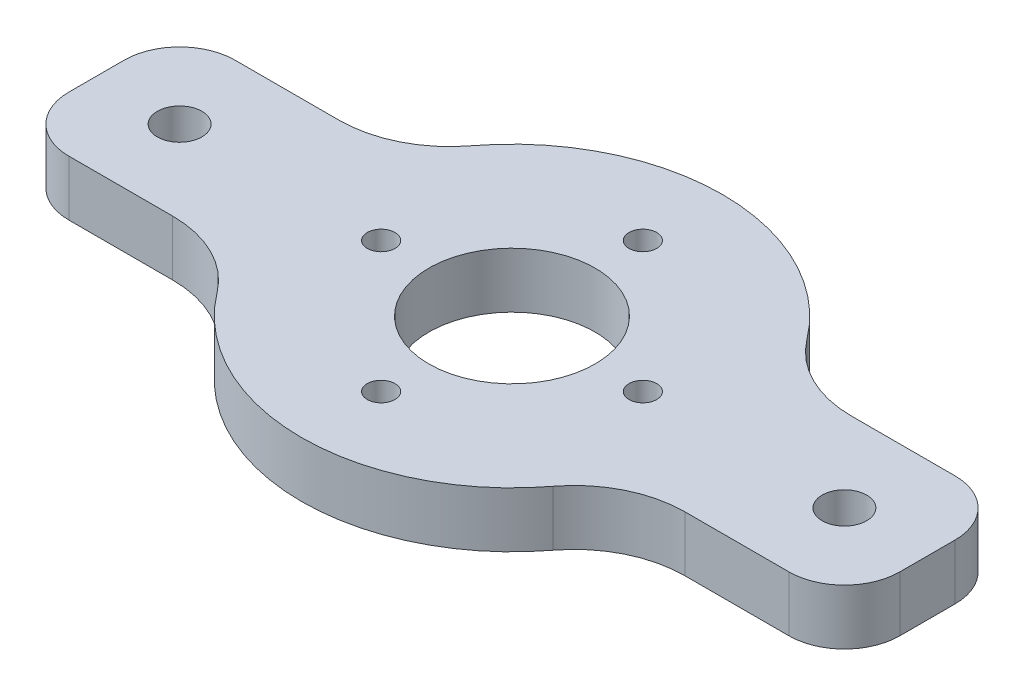
ISO-10303-21;
HEADER;
FILE_DESCRIPTION(('STEP AP214'),'2;1');
FILE_NAME('part.step','',(''),(''),'','','');
FILE_SCHEMA(('AUTOMOTIVE_DESIGN { 1 0 10303 214 1 1 1 1 }'));
ENDSEC;
DATA;
#1=APPLICATION_CONTEXT('core data for automotive mechanical design processes');
#2=APPLICATION_PROTOCOL_DEFINITION('international standard','automotive_design',2000,#1);
#3=PRODUCT_CONTEXT('',#1,'mechanical');
#4=PRODUCT('Part','Part','',(#3));
#5=PRODUCT_RELATED_PRODUCT_CATEGORY('part','',(#4));
#6=PRODUCT_DEFINITION_FORMATION('','',#4);
#7=PRODUCT_DEFINITION_CONTEXT('part definition',#1,'design');
#8=PRODUCT_DEFINITION('design','',#6,#7);
#9=PRODUCT_DEFINITION_SHAPE('','',#8);
#10=(LENGTH_UNIT() NAMED_UNIT(*) SI_UNIT(.MILLI.,.METRE.));
#11=(NAMED_UNIT(*) PLANE_ANGLE_UNIT() SI_UNIT($,.RADIAN.));
#12=(NAMED_UNIT(*) SI_UNIT($,.STERADIAN.) SOLID_ANGLE_UNIT());
#13=UNCERTAINTY_MEASURE_WITH_UNIT(LENGTH_MEASURE(1.E-05),#10,'distance_accuracy_value','');
#14=(GEOMETRIC_REPRESENTATION_CONTEXT(3) GLOBAL_UNCERTAINTY_ASSIGNED_CONTEXT((#13)) GLOBAL_UNIT_ASSIGNED_CONTEXT((#10,
#11,#12)) REPRESENTATION_CONTEXT('',''));
#15=CARTESIAN_POINT('',(0.,0.,0.));
#16=DIRECTION('',(0.,0.,1.));
#17=DIRECTION('',(1.,0.,0.));
#18=AXIS2_PLACEMENT_3D('',#15,#16,#17);
#19=CARTESIAN_POINT('',(0.,6.35,-9.525));
#20=DIRECTION('',(0.,0.,-1.));
#21=DIRECTION('',(-1.,0.,0.));
#22=AXIS2_PLACEMENT_3D('',#19,#20,#21);
#23=PLANE('',#22);
#24=DIRECTION('',(1.,0.,0.));
#25=VECTOR('',#24,1.);
#26=CARTESIAN_POINT('',(0.,0.,-9.525));
#27=LINE('',#26,#25);
#28=CARTESIAN_POINT('',(29.3683209428118,0.,-9.525));
#29=VERTEX_POINT('',#28);
#30=CARTESIAN_POINT('',(41.275,0.,-9.525));
#31=VERTEX_POINT('',#30);
#32=EDGE_CURVE('E222',#29,#31,#27,.T.);
#33=ORIENTED_EDGE('',*,*,#32,.F.);
#34=DIRECTION('',(0.,-1.,0.));
#35=VECTOR('',#34,1.);
#36=CARTESIAN_POINT('',(29.3683209428118,6.35,-9.525));
#37=LINE('',#36,#35);
#38=CARTESIAN_POINT('',(29.3683209428118,6.35,-9.525));
#39=VERTEX_POINT('',#38);
#40=EDGE_CURVE('E11',#39,#29,#37,.T.);
#41=ORIENTED_EDGE('',*,*,#40,.F.);
#42=DIRECTION('',(1.,0.,0.));
#43=VECTOR('',#42,1.);
#44=CARTESIAN_POINT('',(0.,6.35,-9.525));
#45=LINE('',#44,#43);
#46=CARTESIAN_POINT('',(41.275,6.35,-9.525));
#47=VERTEX_POINT('',#46);
#48=EDGE_CURVE('E305',#39,#47,#45,.T.);
#49=ORIENTED_EDGE('',*,*,#48,.T.);
#50=DIRECTION('',(0.,-1.,0.));
#51=VECTOR('',#50,1.);
#52=CARTESIAN_POINT('',(41.275,6.35,-9.525));
#53=LINE('',#52,#51);
#54=EDGE_CURVE('E62',#47,#31,#53,.T.);
#55=ORIENTED_EDGE('',*,*,#54,.T.);
#56=EDGE_LOOP('',(#33,#41,#49,#55));
#57=FACE_BOUND('',#56,.T.);
#58=ADVANCED_FACE('F45',(#57),#23,.T.);
#59=CARTESIAN_POINT('',(29.3683209428118,6.35,-22.225));
#60=DIRECTION('',(0.,-1.,0.));
#61=DIRECTION('',(0.,0.,-1.));
#62=AXIS2_PLACEMENT_3D('',#59,#60,#61);
#63=CYLINDRICAL_SURFACE('',#62,12.7);
#64=CARTESIAN_POINT('',(29.3683209428118,0.,-22.225));
#65=DIRECTION('',(0.,1.,0.));
#66=DIRECTION('',(0.,0.,1.));
#67=AXIS2_PLACEMENT_3D('',#64,#65,#66);
#68=CIRCLE('',#67,12.7);
#69=CARTESIAN_POINT('',(19.2413137211526,0.,-14.5612068965517));
#70=VERTEX_POINT('',#69);
#71=EDGE_CURVE('E225',#29,#70,#68,.F.);
#72=ORIENTED_EDGE('',*,*,#71,.T.);
#73=DIRECTION('',(0.,-1.,0.));
#74=VECTOR('',#73,1.);
#75=CARTESIAN_POINT('',(19.2413137211526,6.35,-14.5612068965517));
#76=LINE('',#75,#74);
#77=CARTESIAN_POINT('',(19.2413137211526,6.35,-14.5612068965517));
#78=VERTEX_POINT('',#77);
#79=EDGE_CURVE('E54',#78,#70,#76,.T.);
#80=ORIENTED_EDGE('',*,*,#79,.F.);
#81=CARTESIAN_POINT('',(29.3683209428118,6.35,-22.225));
#82=DIRECTION('',(0.,1.,0.));
#83=DIRECTION('',(0.,0.,1.));
#84=AXIS2_PLACEMENT_3D('',#81,#82,#83);
#85=CIRCLE('',#84,12.7);
#86=EDGE_CURVE('E375',#39,#78,#85,.F.);
#87=ORIENTED_EDGE('',*,*,#86,.F.);
#88=ORIENTED_EDGE('',*,*,#40,.T.);
#89=EDGE_LOOP('',(#72,#80,#87,#88));
#90=FACE_BOUND('',#89,.T.);
#91=ADVANCED_FACE('F424',(#90),#63,.F.);
#92=CARTESIAN_POINT('',(0.,6.35,0.));
#93=DIRECTION('',(0.,-1.,0.));
#94=DIRECTION('',(0.,0.,-1.));
#95=AXIS2_PLACEMENT_3D('',#92,#93,#94);
#96=CYLINDRICAL_SURFACE('',#95,24.13);
#97=CARTESIAN_POINT('',(0.,0.,0.));
#98=DIRECTION('',(0.,1.,0.));
#99=DIRECTION('',(0.,0.,1.));
#100=AXIS2_PLACEMENT_3D('',#97,#98,#99);
#101=CIRCLE('',#100,24.13);
#102=CARTESIAN_POINT('',(-19.2413137211526,0.,-14.5612068965517));
#103=VERTEX_POINT('',#102);
#104=EDGE_CURVE('E228',#70,#103,#101,.T.);
#105=ORIENTED_EDGE('',*,*,#104,.T.);
#106=DIRECTION('',(0.,-1.,0.));
#107=VECTOR('',#106,1.);
#108=CARTESIAN_POINT('',(-19.2413137211526,6.35,-14.5612068965517));
#109=LINE('',#108,#107);
#110=CARTESIAN_POINT('',(-19.2413137211526,6.35,-14.5612068965517));
#111=VERTEX_POINT('',#110);
#112=EDGE_CURVE('E342',#111,#103,#109,.T.);
#113=ORIENTED_EDGE('',*,*,#112,.F.);
#114=CARTESIAN_POINT('',(0.,6.35,0.));
#115=DIRECTION('',(0.,1.,0.));
#116=DIRECTION('',(0.,0.,1.));
#117=AXIS2_PLACEMENT_3D('',#114,#115,#116);
#118=CIRCLE('',#117,24.13);
#119=EDGE_CURVE('E352',#78,#111,#118,.T.);
#120=ORIENTED_EDGE('',*,*,#119,.F.);
#121=ORIENTED_EDGE('',*,*,#79,.T.);
#122=EDGE_LOOP('',(#105,#113,#120,#121));
#123=FACE_BOUND('',#122,.T.);
#124=ADVANCED_FACE('F350',(#123),#96,.T.);
#125=CARTESIAN_POINT('',(-29.3683209428118,6.35,-22.225));
#126=DIRECTION('',(0.,-1.,0.));
#127=DIRECTION('',(0.,0.,-1.));
#128=AXIS2_PLACEMENT_3D('',#125,#126,#127);
#129=CYLINDRICAL_SURFACE('',#128,12.7);
#130=CARTESIAN_POINT('',(-29.3683209428118,0.,-22.225));
#131=DIRECTION('',(0.,1.,0.));
#132=DIRECTION('',(0.,0.,1.));
#133=AXIS2_PLACEMENT_3D('',#130,#131,#132);
#134=CIRCLE('',#133,12.7);
#135=CARTESIAN_POINT('',(-29.3683209428118,0.,-9.525));
#136=VERTEX_POINT('',#135);
#137=EDGE_CURVE('E232',#136,#103,#134,.T.);
#138=ORIENTED_EDGE('',*,*,#137,.F.);
#139=DIRECTION('',(0.,-1.,0.));
#140=VECTOR('',#139,1.);
#141=CARTESIAN_POINT('',(-29.3683209428118,6.35,-9.525));
#142=LINE('',#141,#140);
#143=CARTESIAN_POINT('',(-29.3683209428118,6.35,-9.525));
#144=VERTEX_POINT('',#143);
#145=EDGE_CURVE('E339',#144,#136,#142,.T.);
#146=ORIENTED_EDGE('',*,*,#145,.F.);
#147=CARTESIAN_POINT('',(-29.3683209428118,6.35,-22.225));
#148=DIRECTION('',(0.,1.,0.));
#149=DIRECTION('',(0.,0.,1.));
#150=AXIS2_PLACEMENT_3D('',#147,#148,#149);
#151=CIRCLE('',#150,12.7);
#152=EDGE_CURVE('E365',#144,#111,#151,.T.);
#153=ORIENTED_EDGE('',*,*,#152,.T.);
#154=ORIENTED_EDGE('',*,*,#112,.T.);
#155=EDGE_LOOP('',(#138,#146,#153,#154));
#156=FACE_BOUND('',#155,.T.);
#157=ADVANCED_FACE('F362',(#156),#129,.F.);
#158=CARTESIAN_POINT('',(0.,6.35,-9.525));
#159=DIRECTION('',(0.,0.,-1.));
#160=DIRECTION('',(-1.,0.,0.));
#161=AXIS2_PLACEMENT_3D('',#158,#159,#160);
#162=PLANE('',#161);
#163=DIRECTION('',(1.,0.,0.));
#164=VECTOR('',#163,1.);
#165=CARTESIAN_POINT('',(0.,0.,-9.525));
#166=LINE('',#165,#164);
#167=CARTESIAN_POINT('',(-41.275,0.,-9.525));
#168=VERTEX_POINT('',#167);
#169=EDGE_CURVE('E236',#168,#136,#166,.T.);
#170=ORIENTED_EDGE('',*,*,#169,.F.);
#171=DIRECTION('',(0.,-1.,0.));
#172=VECTOR('',#171,1.);
#173=CARTESIAN_POINT('',(-41.275,6.35,-9.525));
#174=LINE('',#173,#172);
#175=CARTESIAN_POINT('',(-41.275,6.35,-9.525));
#176=VERTEX_POINT('',#175);
#177=EDGE_CURVE('E336',#176,#168,#174,.T.);
#178=ORIENTED_EDGE('',*,*,#177,.F.);
#179=DIRECTION('',(1.,0.,0.));
#180=VECTOR('',#179,1.);
#181=CARTESIAN_POINT('',(0.,6.35,-9.525));
#182=LINE('',#181,#180);
#183=EDGE_CURVE('E369',#176,#144,#182,.T.);
#184=ORIENTED_EDGE('',*,*,#183,.T.);
#185=ORIENTED_EDGE('',*,*,#145,.T.);
#186=EDGE_LOOP('',(#170,#178,#184,#185));
#187=FACE_BOUND('',#186,.T.);
#188=ADVANCED_FACE('F632',(#187),#162,.T.);
#189=CARTESIAN_POINT('',(-41.275,6.35,-3.175));
#190=DIRECTION('',(0.,-1.,0.));
#191=DIRECTION('',(0.,0.,-1.));
#192=AXIS2_PLACEMENT_3D('',#189,#190,#191);
#193=CYLINDRICAL_SURFACE('',#192,6.35);
#194=CARTESIAN_POINT('',(-41.275,0.,-3.175));
#195=DIRECTION('',(0.,1.,0.));
#196=DIRECTION('',(0.,0.,1.));
#197=AXIS2_PLACEMENT_3D('',#194,#195,#196);
#198=CIRCLE('',#197,6.35);
#199=CARTESIAN_POINT('',(-47.625,0.,-3.175));
#200=VERTEX_POINT('',#199);
#201=EDGE_CURVE('E240',#168,#200,#198,.T.);
#202=ORIENTED_EDGE('',*,*,#201,.T.);
#203=DIRECTION('',(0.,-1.,0.));
#204=VECTOR('',#203,1.);
#205=CARTESIAN_POINT('',(-47.625,6.35,-3.175));
#206=LINE('',#205,#204);
#207=CARTESIAN_POINT('',(-47.625,6.35,-3.175));
#208=VERTEX_POINT('',#207);
#209=EDGE_CURVE('E332',#208,#200,#206,.T.);
#210=ORIENTED_EDGE('',*,*,#209,.F.);
#211=CARTESIAN_POINT('',(-41.275,6.35,-3.175));
#212=DIRECTION('',(0.,1.,0.));
#213=DIRECTION('',(0.,0.,1.));
#214=AXIS2_PLACEMENT_3D('',#211,#212,#213);
#215=CIRCLE('',#214,6.35);
#216=EDGE_CURVE('E373',#176,#208,#215,.T.);
#217=ORIENTED_EDGE('',*,*,#216,.F.);
#218=ORIENTED_EDGE('',*,*,#177,.T.);
#219=EDGE_LOOP('',(#202,#210,#217,#218));
#220=FACE_BOUND('',#219,.T.);
#221=ADVANCED_FACE('F621',(#220),#193,.T.);
#222=CARTESIAN_POINT('',(-47.625,6.35,0.));
#223=DIRECTION('',(1.,0.,0.));
#224=DIRECTION('',(0.,0.,-1.));
#225=AXIS2_PLACEMENT_3D('',#222,#223,#224);
#226=PLANE('',#225);
#227=DIRECTION('',(0.,0.,1.));
#228=VECTOR('',#227,1.);
#229=CARTESIAN_POINT('',(-47.625,0.,0.));
#230=LINE('',#229,#228);
#231=CARTESIAN_POINT('',(-47.625,0.,3.175));
#232=VERTEX_POINT('',#231);
#233=EDGE_CURVE('E243',#200,#232,#230,.T.);
#234=ORIENTED_EDGE('',*,*,#233,.T.);
#235=DIRECTION('',(0.,-1.,0.));
#236=VECTOR('',#235,1.);
#237=CARTESIAN_POINT('',(-47.625,6.35,3.175));
#238=LINE('',#237,#236);
#239=CARTESIAN_POINT('',(-47.625,6.35,3.175));
#240=VERTEX_POINT('',#239);
#241=EDGE_CURVE('E329',#240,#232,#238,.T.);
#242=ORIENTED_EDGE('',*,*,#241,.F.);
#243=DIRECTION('',(0.,0.,1.));
#244=VECTOR('',#243,1.);
#245=CARTESIAN_POINT('',(-47.625,6.35,0.));
#246=LINE('',#245,#244);
#247=EDGE_CURVE('E381',#208,#240,#246,.T.);
#248=ORIENTED_EDGE('',*,*,#247,.F.);
#249=ORIENTED_EDGE('',*,*,#209,.T.);
#250=EDGE_LOOP('',(#234,#242,#248,#249));
#251=FACE_BOUND('',#250,.T.);
#252=ADVANCED_FACE('F610',(#251),#226,.F.);
#253=CARTESIAN_POINT('',(-41.275,6.35,3.175));
#254=DIRECTION('',(0.,-1.,0.));
#255=DIRECTION('',(0.,0.,-1.));
#256=AXIS2_PLACEMENT_3D('',#253,#254,#255);
#257=CYLINDRICAL_SURFACE('',#256,6.35);
#258=CARTESIAN_POINT('',(-41.275,0.,3.175));
#259=DIRECTION('',(0.,1.,0.));
#260=DIRECTION('',(0.,0.,1.));
#261=AXIS2_PLACEMENT_3D('',#258,#259,#260);
#262=CIRCLE('',#261,6.35);
#263=CARTESIAN_POINT('',(-41.275,0.,9.525));
#264=VERTEX_POINT('',#263);
#265=EDGE_CURVE('E247',#264,#232,#262,.F.);
#266=ORIENTED_EDGE('',*,*,#265,.F.);
#267=DIRECTION('',(0.,-1.,0.));
#268=VECTOR('',#267,1.);
#269=CARTESIAN_POINT('',(-41.275,6.35,9.525));
#270=LINE('',#269,#268);
#271=CARTESIAN_POINT('',(-41.275,6.35,9.525));
#272=VERTEX_POINT('',#271);
#273=EDGE_CURVE('E326',#272,#264,#270,.T.);
#274=ORIENTED_EDGE('',*,*,#273,.F.);
#275=CARTESIAN_POINT('',(-41.275,6.35,3.175));
#276=DIRECTION('',(0.,1.,0.));
#277=DIRECTION('',(0.,0.,1.));
#278=AXIS2_PLACEMENT_3D('',#275,#276,#277);
#279=CIRCLE('',#278,6.35);
#280=EDGE_CURVE('E384',#272,#240,#279,.F.);
#281=ORIENTED_EDGE('',*,*,#280,.T.);
#282=ORIENTED_EDGE('',*,*,#241,.T.);
#283=EDGE_LOOP('',(#266,#274,#281,#282));
#284=FACE_BOUND('',#283,.T.);
#285=ADVANCED_FACE('F599',(#284),#257,.T.);
#286=CARTESIAN_POINT('',(0.,6.35,9.525));
#287=DIRECTION('',(0.,0.,-1.));
#288=DIRECTION('',(-1.,0.,0.));
#289=AXIS2_PLACEMENT_3D('',#286,#287,#288);
#290=PLANE('',#289);
#291=DIRECTION('',(1.,0.,0.));
#292=VECTOR('',#291,1.);
#293=CARTESIAN_POINT('',(0.,0.,9.525));
#294=LINE('',#293,#292);
#295=CARTESIAN_POINT('',(-29.3683209428118,0.,9.525));
#296=VERTEX_POINT('',#295);
#297=EDGE_CURVE('E251',#264,#296,#294,.T.);
#298=ORIENTED_EDGE('',*,*,#297,.T.);
#299=DIRECTION('',(0.,-1.,0.));
#300=VECTOR('',#299,1.);
#301=CARTESIAN_POINT('',(-29.3683209428118,6.35,9.525));
#302=LINE('',#301,#300);
#303=CARTESIAN_POINT('',(-29.3683209428118,6.35,9.525));
#304=VERTEX_POINT('',#303);
#305=EDGE_CURVE('E322',#304,#296,#302,.T.);
#306=ORIENTED_EDGE('',*,*,#305,.F.);
#307=DIRECTION('',(1.,0.,0.));
#308=VECTOR('',#307,1.);
#309=CARTESIAN_POINT('',(0.,6.35,9.525));
#310=LINE('',#309,#308);
#311=EDGE_CURVE('E388',#272,#304,#310,.T.);
#312=ORIENTED_EDGE('',*,*,#311,.F.);
#313=ORIENTED_EDGE('',*,*,#273,.T.);
#314=EDGE_LOOP('',(#298,#306,#312,#313));
#315=FACE_BOUND('',#314,.T.);
#316=ADVANCED_FACE('F588',(#315),#290,.F.);
#317=CARTESIAN_POINT('',(-29.3683209428118,6.35,22.225));
#318=DIRECTION('',(0.,-1.,0.));
#319=DIRECTION('',(0.,0.,-1.));
#320=AXIS2_PLACEMENT_3D('',#317,#318,#319);
#321=CYLINDRICAL_SURFACE('',#320,12.7);
#322=CARTESIAN_POINT('',(-29.3683209428118,0.,22.225));
#323=DIRECTION('',(0.,1.,0.));
#324=DIRECTION('',(0.,0.,1.));
#325=AXIS2_PLACEMENT_3D('',#322,#323,#324);
#326=CIRCLE('',#325,12.7);
#327=CARTESIAN_POINT('',(-19.2413137211526,0.,14.5612068965517));
#328=VERTEX_POINT('',#327);
#329=EDGE_CURVE('E254',#296,#328,#326,.F.);
#330=ORIENTED_EDGE('',*,*,#329,.T.);
#331=DIRECTION('',(0.,-1.,0.));
#332=VECTOR('',#331,1.);
#333=CARTESIAN_POINT('',(-19.2413137211526,6.35,14.5612068965517));
#334=LINE('',#333,#332);
#335=CARTESIAN_POINT('',(-19.2413137211526,6.35,14.5612068965517));
#336=VERTEX_POINT('',#335);
#337=EDGE_CURVE('E318',#336,#328,#334,.T.);
#338=ORIENTED_EDGE('',*,*,#337,.F.);
#339=CARTESIAN_POINT('',(-29.3683209428118,6.35,22.225));
#340=DIRECTION('',(0.,1.,0.));
#341=DIRECTION('',(0.,0.,1.));
#342=AXIS2_PLACEMENT_3D('',#339,#340,#341);
#343=CIRCLE('',#342,12.7);
#344=EDGE_CURVE('E391',#304,#336,#343,.F.);
#345=ORIENTED_EDGE('',*,*,#344,.F.);
#346=ORIENTED_EDGE('',*,*,#305,.T.);
#347=EDGE_LOOP('',(#330,#338,#345,#346));
#348=FACE_BOUND('',#347,.T.);
#349=ADVANCED_FACE('F578',(#348),#321,.F.);
#350=CARTESIAN_POINT('',(0.,6.35,0.));
#351=DIRECTION('',(0.,-1.,0.));
#352=DIRECTION('',(0.,0.,-1.));
#353=AXIS2_PLACEMENT_3D('',#350,#351,#352);
#354=CYLINDRICAL_SURFACE('',#353,24.13);
#355=CARTESIAN_POINT('',(0.,0.,0.));
#356=DIRECTION('',(0.,1.,0.));
#357=DIRECTION('',(0.,0.,1.));
#358=AXIS2_PLACEMENT_3D('',#355,#356,#357);
#359=CIRCLE('',#358,24.13);
#360=CARTESIAN_POINT('',(19.2413137211526,0.,14.5612068965517));
#361=VERTEX_POINT('',#360);
#362=EDGE_CURVE('E257',#328,#361,#359,.T.);
#363=ORIENTED_EDGE('',*,*,#362,.T.);
#364=DIRECTION('',(0.,-1.,0.));
#365=VECTOR('',#364,1.);
#366=CARTESIAN_POINT('',(19.2413137211526,6.35,14.5612068965517));
#367=LINE('',#366,#365);
#368=CARTESIAN_POINT('',(19.2413137211526,6.35,14.5612068965517));
#369=VERTEX_POINT('',#368);
#370=EDGE_CURVE('E315',#369,#361,#367,.T.);
#371=ORIENTED_EDGE('',*,*,#370,.F.);
#372=CARTESIAN_POINT('',(0.,6.35,0.));
#373=DIRECTION('',(0.,1.,0.));
#374=DIRECTION('',(0.,0.,1.));
#375=AXIS2_PLACEMENT_3D('',#372,#373,#374);
#376=CIRCLE('',#375,24.13);
#377=EDGE_CURVE('E394',#336,#369,#376,.T.);
#378=ORIENTED_EDGE('',*,*,#377,.F.);
#379=ORIENTED_EDGE('',*,*,#337,.T.);
#380=EDGE_LOOP('',(#363,#371,#378,#379));
#381=FACE_BOUND('',#380,.T.);
#382=ADVANCED_FACE('F409',(#381),#354,.T.);
#383=CARTESIAN_POINT('',(29.3683209428118,6.35,22.225));
#384=DIRECTION('',(0.,-1.,0.));
#385=DIRECTION('',(0.,0.,-1.));
#386=AXIS2_PLACEMENT_3D('',#383,#384,#385);
#387=CYLINDRICAL_SURFACE('',#386,12.7);
#388=CARTESIAN_POINT('',(29.3683209428118,0.,22.225));
#389=DIRECTION('',(0.,1.,0.));
#390=DIRECTION('',(0.,0.,1.));
#391=AXIS2_PLACEMENT_3D('',#388,#389,#390);
#392=CIRCLE('',#391,12.7);
#393=CARTESIAN_POINT('',(29.3683209428118,0.,9.525));
#394=VERTEX_POINT('',#393);
#395=EDGE_CURVE('E261',#394,#361,#392,.T.);
#396=ORIENTED_EDGE('',*,*,#395,.F.);
#397=DIRECTION('',(0.,-1.,0.));
#398=VECTOR('',#397,1.);
#399=CARTESIAN_POINT('',(29.3683209428118,6.35,9.525));
#400=LINE('',#399,#398);
#401=CARTESIAN_POINT('',(29.3683209428118,6.35,9.525));
#402=VERTEX_POINT('',#401);
#403=EDGE_CURVE('E312',#402,#394,#400,.T.);
#404=ORIENTED_EDGE('',*,*,#403,.F.);
#405=CARTESIAN_POINT('',(29.3683209428118,6.35,22.225));
#406=DIRECTION('',(0.,1.,0.));
#407=DIRECTION('',(0.,0.,1.));
#408=AXIS2_PLACEMENT_3D('',#405,#406,#407);
#409=CIRCLE('',#408,12.7);
#410=EDGE_CURVE('E397',#402,#369,#409,.T.);
#411=ORIENTED_EDGE('',*,*,#410,.T.);
#412=ORIENTED_EDGE('',*,*,#370,.T.);
#413=EDGE_LOOP('',(#396,#404,#411,#412));
#414=FACE_BOUND('',#413,.T.);
#415=ADVANCED_FACE('F403',(#414),#387,.F.);
#416=CARTESIAN_POINT('',(0.,6.35,9.525));
#417=DIRECTION('',(0.,0.,-1.));
#418=DIRECTION('',(-1.,0.,0.));
#419=AXIS2_PLACEMENT_3D('',#416,#417,#418);
#420=PLANE('',#419);
#421=DIRECTION('',(1.,0.,0.));
#422=VECTOR('',#421,1.);
#423=CARTESIAN_POINT('',(0.,0.,9.525));
#424=LINE('',#423,#422);
#425=CARTESIAN_POINT('',(41.275,0.,9.525));
#426=VERTEX_POINT('',#425);
#427=EDGE_CURVE('E265',#394,#426,#424,.T.);
#428=ORIENTED_EDGE('',*,*,#427,.T.);
#429=DIRECTION('',(0.,-1.,0.));
#430=VECTOR('',#429,1.);
#431=CARTESIAN_POINT('',(41.275,6.35,9.525));
#432=LINE('',#431,#430);
#433=CARTESIAN_POINT('',(41.275,6.35,9.525));
#434=VERTEX_POINT('',#433);
#435=EDGE_CURVE('E184',#434,#426,#432,.T.);
#436=ORIENTED_EDGE('',*,*,#435,.F.);
#437=DIRECTION('',(1.,0.,0.));
#438=VECTOR('',#437,1.);
#439=CARTESIAN_POINT('',(0.,6.35,9.525));
#440=LINE('',#439,#438);
#441=EDGE_CURVE('E170',#402,#434,#440,.T.);
#442=ORIENTED_EDGE('',*,*,#441,.F.);
#443=ORIENTED_EDGE('',*,*,#403,.T.);
#444=EDGE_LOOP('',(#428,#436,#442,#443));
#445=FACE_BOUND('',#444,.T.);
#446=ADVANCED_FACE('F414',(#445),#420,.F.);
#447=CARTESIAN_POINT('',(41.275,6.35,3.175));
#448=DIRECTION('',(0.,-1.,0.));
#449=DIRECTION('',(0.,0.,-1.));
#450=AXIS2_PLACEMENT_3D('',#447,#448,#449);
#451=CYLINDRICAL_SURFACE('',#450,6.35);
#452=CARTESIAN_POINT('',(41.275,0.,3.175));
#453=DIRECTION('',(0.,1.,0.));
#454=DIRECTION('',(0.,0.,1.));
#455=AXIS2_PLACEMENT_3D('',#452,#453,#454);
#456=CIRCLE('',#455,6.35);
#457=CARTESIAN_POINT('',(47.625,0.,3.175));
#458=VERTEX_POINT('',#457);
#459=EDGE_CURVE('E180',#426,#458,#456,.T.);
#460=ORIENTED_EDGE('',*,*,#459,.T.);
#461=DIRECTION('',(0.,-1.,0.));
#462=VECTOR('',#461,1.);
#463=CARTESIAN_POINT('',(47.625,6.35,3.175));
#464=LINE('',#463,#462);
#465=CARTESIAN_POINT('',(47.625,6.35,3.175));
#466=VERTEX_POINT('',#465);
#467=EDGE_CURVE('E177',#466,#458,#464,.T.);
#468=ORIENTED_EDGE('',*,*,#467,.F.);
#469=CARTESIAN_POINT('',(41.275,6.35,3.175));
#470=DIRECTION('',(0.,1.,0.));
#471=DIRECTION('',(0.,0.,1.));
#472=AXIS2_PLACEMENT_3D('',#469,#470,#471);
#473=CIRCLE('',#472,6.35);
#474=EDGE_CURVE('E160',#434,#466,#473,.T.);
#475=ORIENTED_EDGE('',*,*,#474,.F.);
#476=ORIENTED_EDGE('',*,*,#435,.T.);
#477=EDGE_LOOP('',(#460,#468,#475,#476));
#478=FACE_BOUND('',#477,.T.);
#479=ADVANCED_FACE('F178',(#478),#451,.T.);
#480=CARTESIAN_POINT('',(47.625,6.35,0.));
#481=DIRECTION('',(1.,0.,0.));
#482=DIRECTION('',(0.,0.,-1.));
#483=AXIS2_PLACEMENT_3D('',#480,#481,#482);
#484=PLANE('',#483);
#485=DIRECTION('',(0.,0.,1.));
#486=VECTOR('',#485,1.);
#487=CARTESIAN_POINT('',(47.625,0.,0.));
#488=LINE('',#487,#486);
#489=CARTESIAN_POINT('',(47.625,0.,-3.175));
#490=VERTEX_POINT('',#489);
#491=EDGE_CURVE('E270',#490,#458,#488,.T.);
#492=ORIENTED_EDGE('',*,*,#491,.F.);
#493=DIRECTION('',(0.,-1.,0.));
#494=VECTOR('',#493,1.);
#495=CARTESIAN_POINT('',(47.625,6.35,-3.175));
#496=LINE('',#495,#494);
#497=CARTESIAN_POINT('',(47.625,6.35,-3.175));
#498=VERTEX_POINT('',#497);
#499=EDGE_CURVE('E111',#498,#490,#496,.T.);
#500=ORIENTED_EDGE('',*,*,#499,.F.);
#501=DIRECTION('',(0.,0.,1.));
#502=VECTOR('',#501,1.);
#503=CARTESIAN_POINT('',(47.625,6.35,0.));
#504=LINE('',#503,#502);
#505=EDGE_CURVE('E167',#498,#466,#504,.T.);
#506=ORIENTED_EDGE('',*,*,#505,.T.);
#507=ORIENTED_EDGE('',*,*,#467,.T.);
#508=EDGE_LOOP('',(#492,#500,#506,#507));
#509=FACE_BOUND('',#508,.T.);
#510=ADVANCED_FACE('F186',(#509),#484,.T.);
#511=CARTESIAN_POINT('',(15.,6.35,0.));
#512=DIRECTION('',(0.,-1.,0.));
#513=DIRECTION('',(0.,0.,-1.));
#514=AXIS2_PLACEMENT_3D('',#511,#512,#513);
#515=CYLINDRICAL_SURFACE('',#514,1.5875);
#516=CARTESIAN_POINT('',(15.,6.35,0.));
#517=DIRECTION('',(0.,1.,0.));
#518=DIRECTION('',(0.,0.,1.));
#519=AXIS2_PLACEMENT_3D('',#516,#517,#518);
#520=CIRCLE('',#519,1.5875);
#521=CARTESIAN_POINT('',(15.,6.35,1.5875));
#522=VERTEX_POINT('',#521);
#523=EDGE_CURVE('E214',#522,#522,#520,.T.);
#524=ORIENTED_EDGE('',*,*,#523,.T.);
#525=EDGE_LOOP('',(#524));
#526=FACE_BOUND('',#525,.T.);
#527=CARTESIAN_POINT('',(15.,0.,0.));
#528=DIRECTION('',(0.,1.,0.));
#529=DIRECTION('',(0.,0.,1.));
#530=AXIS2_PLACEMENT_3D('',#527,#528,#529);
#531=CIRCLE('',#530,1.5875);
#532=CARTESIAN_POINT('',(15.,0.,1.5875));
#533=VERTEX_POINT('',#532);
#534=EDGE_CURVE('E297',#533,#533,#531,.T.);
#535=ORIENTED_EDGE('',*,*,#534,.F.);
#536=EDGE_LOOP('',(#535));
#537=FACE_BOUND('',#536,.T.);
#538=ADVANCED_FACE('F445',(#526,#537),#515,.F.);
#539=CARTESIAN_POINT('',(0.,6.35,-15.));
#540=DIRECTION('',(0.,-1.,0.));
#541=DIRECTION('',(0.,0.,-1.));
#542=AXIS2_PLACEMENT_3D('',#539,#540,#541);
#543=CYLINDRICAL_SURFACE('',#542,1.5875);
#544=CARTESIAN_POINT('',(0.,6.35,-15.));
#545=DIRECTION('',(0.,1.,0.));
#546=DIRECTION('',(0.,0.,1.));
#547=AXIS2_PLACEMENT_3D('',#544,#545,#546);
#548=CIRCLE('',#547,1.5875);
#549=CARTESIAN_POINT('',(0.,6.35,-13.4125));
#550=VERTEX_POINT('',#549);
#551=EDGE_CURVE('E210',#550,#550,#548,.T.);
#552=ORIENTED_EDGE('',*,*,#551,.T.);
#553=EDGE_LOOP('',(#552));
#554=FACE_BOUND('',#553,.T.);
#555=CARTESIAN_POINT('',(0.,0.,-15.));
#556=DIRECTION('',(0.,1.,0.));
#557=DIRECTION('',(0.,0.,1.));
#558=AXIS2_PLACEMENT_3D('',#555,#556,#557);
#559=CIRCLE('',#558,1.5875);
#560=CARTESIAN_POINT('',(0.,0.,-13.4125));
#561=VERTEX_POINT('',#560);
#562=EDGE_CURVE('E293',#561,#561,#559,.T.);
#563=ORIENTED_EDGE('',*,*,#562,.F.);
#564=EDGE_LOOP('',(#563));
#565=FACE_BOUND('',#564,.T.);
#566=ADVANCED_FACE('F449',(#554,#565),#543,.F.);
#567=CARTESIAN_POINT('',(-38.1,6.35,0.));
#568=DIRECTION('',(0.,-1.,0.));
#569=DIRECTION('',(0.,0.,-1.));
#570=AXIS2_PLACEMENT_3D('',#567,#568,#569);
#571=CYLINDRICAL_SURFACE('',#570,2.5527);
#572=CARTESIAN_POINT('',(-38.1,6.35,0.));
#573=DIRECTION('',(0.,1.,0.));
#574=DIRECTION('',(0.,0.,1.));
#575=AXIS2_PLACEMENT_3D('',#572,#573,#574);
#576=CIRCLE('',#575,2.5527);
#577=CARTESIAN_POINT('',(-38.1,6.35,2.5527));
#578=VERTEX_POINT('',#577);
#579=EDGE_CURVE('E206',#578,#578,#576,.T.);
#580=ORIENTED_EDGE('',*,*,#579,.T.);
#581=EDGE_LOOP('',(#580));
#582=FACE_BOUND('',#581,.T.);
#583=CARTESIAN_POINT('',(-38.1,0.,0.));
#584=DIRECTION('',(0.,1.,0.));
#585=DIRECTION('',(0.,0.,1.));
#586=AXIS2_PLACEMENT_3D('',#583,#584,#585);
#587=CIRCLE('',#586,2.5527);
#588=CARTESIAN_POINT('',(-38.1,0.,2.5527));
#589=VERTEX_POINT('',#588);
#590=EDGE_CURVE('E289',#589,#589,#587,.T.);
#591=ORIENTED_EDGE('',*,*,#590,.F.);
#592=EDGE_LOOP('',(#591));
#593=FACE_BOUND('',#592,.T.);
#594=ADVANCED_FACE('F455',(#582,#593),#571,.F.);
#595=CARTESIAN_POINT('',(0.,6.35,15.));
#596=DIRECTION('',(0.,-1.,0.));
#597=DIRECTION('',(0.,0.,-1.));
#598=AXIS2_PLACEMENT_3D('',#595,#596,#597);
#599=CYLINDRICAL_SURFACE('',#598,1.5875);
#600=CARTESIAN_POINT('',(0.,6.35,15.));
#601=DIRECTION('',(0.,1.,0.));
#602=DIRECTION('',(0.,0.,1.));
#603=AXIS2_PLACEMENT_3D('',#600,#601,#602);
#604=CIRCLE('',#603,1.5875);
#605=CARTESIAN_POINT('',(0.,6.35,16.5875));
#606=VERTEX_POINT('',#605);
#607=EDGE_CURVE('E202',#606,#606,#604,.T.);
#608=ORIENTED_EDGE('',*,*,#607,.T.);
#609=EDGE_LOOP('',(#608));
#610=FACE_BOUND('',#609,.T.);
#611=CARTESIAN_POINT('',(0.,0.,15.));
#612=DIRECTION('',(0.,1.,0.));
#613=DIRECTION('',(0.,0.,1.));
#614=AXIS2_PLACEMENT_3D('',#611,#612,#613);
#615=CIRCLE('',#614,1.5875);
#616=CARTESIAN_POINT('',(0.,0.,16.5875));
#617=VERTEX_POINT('',#616);
#618=EDGE_CURVE('E285',#617,#617,#615,.T.);
#619=ORIENTED_EDGE('',*,*,#618,.F.);
#620=EDGE_LOOP('',(#619));
#621=FACE_BOUND('',#620,.T.);
#622=ADVANCED_FACE('F463',(#610,#621),#599,.F.);
#623=CARTESIAN_POINT('',(0.,6.35,0.));
#624=DIRECTION('',(0.,-1.,0.));
#625=DIRECTION('',(0.,0.,-1.));
#626=AXIS2_PLACEMENT_3D('',#623,#624,#625);
#627=CYLINDRICAL_SURFACE('',#626,9.525);
#628=CARTESIAN_POINT('',(0.,6.35,0.));
#629=DIRECTION('',(0.,1.,0.));
#630=DIRECTION('',(0.,0.,1.));
#631=AXIS2_PLACEMENT_3D('',#628,#629,#630);
#632=CIRCLE('',#631,9.525);
#633=CARTESIAN_POINT('',(0.,6.35,9.525));
#634=VERTEX_POINT('',#633);
#635=EDGE_CURVE('E198',#634,#634,#632,.T.);
#636=ORIENTED_EDGE('',*,*,#635,.T.);
#637=EDGE_LOOP('',(#636));
#638=FACE_BOUND('',#637,.T.);
#639=CARTESIAN_POINT('',(0.,0.,0.));
#640=DIRECTION('',(0.,1.,0.));
#641=DIRECTION('',(0.,0.,1.));
#642=AXIS2_PLACEMENT_3D('',#639,#640,#641);
#643=CIRCLE('',#642,9.525);
#644=CARTESIAN_POINT('',(0.,0.,9.525));
#645=VERTEX_POINT('',#644);
#646=EDGE_CURVE('E281',#645,#645,#643,.T.);
#647=ORIENTED_EDGE('',*,*,#646,.F.);
#648=EDGE_LOOP('',(#647));
#649=FACE_BOUND('',#648,.T.);
#650=ADVANCED_FACE('F439',(#638,#649),#627,.F.);
#651=CARTESIAN_POINT('',(-15.,6.35,0.));
#652=DIRECTION('',(0.,-1.,0.));
#653=DIRECTION('',(0.,0.,-1.));
#654=AXIS2_PLACEMENT_3D('',#651,#652,#653);
#655=CYLINDRICAL_SURFACE('',#654,1.5875);
#656=CARTESIAN_POINT('',(-15.,6.35,0.));
#657=DIRECTION('',(0.,1.,0.));
#658=DIRECTION('',(0.,0.,1.));
#659=AXIS2_PLACEMENT_3D('',#656,#657,#658);
#660=CIRCLE('',#659,1.5875);
#661=CARTESIAN_POINT('',(-15.,6.35,1.5875));
#662=VERTEX_POINT('',#661);
#663=EDGE_CURVE('E191',#662,#662,#660,.T.);
#664=ORIENTED_EDGE('',*,*,#663,.T.);
#665=EDGE_LOOP('',(#664));
#666=FACE_BOUND('',#665,.T.);
#667=CARTESIAN_POINT('',(-15.,0.,0.));
#668=DIRECTION('',(0.,1.,0.));
#669=DIRECTION('',(0.,0.,1.));
#670=AXIS2_PLACEMENT_3D('',#667,#668,#669);
#671=CIRCLE('',#670,1.5875);
#672=CARTESIAN_POINT('',(-15.,0.,1.5875));
#673=VERTEX_POINT('',#672);
#674=EDGE_CURVE('E277',#673,#673,#671,.T.);
#675=ORIENTED_EDGE('',*,*,#674,.F.);
#676=EDGE_LOOP('',(#675));
#677=FACE_BOUND('',#676,.T.);
#678=ADVANCED_FACE('F431',(#666,#677),#655,.F.);
#679=CARTESIAN_POINT('',(41.275,6.35,-3.175));
#680=DIRECTION('',(0.,-1.,0.));
#681=DIRECTION('',(0.,0.,-1.));
#682=AXIS2_PLACEMENT_3D('',#679,#680,#681);
#683=CYLINDRICAL_SURFACE('',#682,6.35);
#684=CARTESIAN_POINT('',(41.275,0.,-3.175));
#685=DIRECTION('',(0.,1.,0.));
#686=DIRECTION('',(0.,0.,1.));
#687=AXIS2_PLACEMENT_3D('',#684,#685,#686);
#688=CIRCLE('',#687,6.35);
#689=EDGE_CURVE('E273',#31,#490,#688,.F.);
#690=ORIENTED_EDGE('',*,*,#689,.F.);
#691=ORIENTED_EDGE('',*,*,#54,.F.);
#692=CARTESIAN_POINT('',(41.275,6.35,-3.175));
#693=DIRECTION('',(0.,1.,0.));
#694=DIRECTION('',(0.,0.,1.));
#695=AXIS2_PLACEMENT_3D('',#692,#693,#694);
#696=CIRCLE('',#695,6.35);
#697=EDGE_CURVE('E188',#47,#498,#696,.F.);
#698=ORIENTED_EDGE('',*,*,#697,.T.);
#699=ORIENTED_EDGE('',*,*,#499,.T.);
#700=EDGE_LOOP('',(#690,#691,#698,#699));
#701=FACE_BOUND('',#700,.T.);
#702=ADVANCED_FACE('F428',(#701),#683,.T.);
#703=CARTESIAN_POINT('',(38.1,6.35,0.));
#704=DIRECTION('',(0.,-1.,0.));
#705=DIRECTION('',(0.,0.,-1.));
#706=AXIS2_PLACEMENT_3D('',#703,#704,#705);
#707=CYLINDRICAL_SURFACE('',#706,2.5527);
#708=CARTESIAN_POINT('',(38.1,6.35,0.));
#709=DIRECTION('',(0.,1.,0.));
#710=DIRECTION('',(0.,0.,1.));
#711=AXIS2_PLACEMENT_3D('',#708,#709,#710);
#712=CIRCLE('',#711,2.5527);
#713=CARTESIAN_POINT('',(38.1,6.35,2.55269999999999));
#714=VERTEX_POINT('',#713);
#715=EDGE_CURVE('E218',#714,#714,#712,.F.);
#716=ORIENTED_EDGE('',*,*,#715,.F.);
#717=EDGE_LOOP('',(#716));
#718=FACE_BOUND('',#717,.T.);
#719=CARTESIAN_POINT('',(38.1,0.,0.));
#720=DIRECTION('',(0.,1.,0.));
#721=DIRECTION('',(0.,0.,1.));
#722=AXIS2_PLACEMENT_3D('',#719,#720,#721);
#723=CIRCLE('',#722,2.5527);
#724=CARTESIAN_POINT('',(38.1,0.,2.55269999999999));
#725=VERTEX_POINT('',#724);
#726=EDGE_CURVE('E301',#725,#725,#723,.F.);
#727=ORIENTED_EDGE('',*,*,#726,.T.);
#728=EDGE_LOOP('',(#727));
#729=FACE_BOUND('',#728,.T.);
#730=ADVANCED_FACE('F430',(#718,#729),#707,.F.);
#731=CARTESIAN_POINT('',(0.,6.35,0.));
#732=DIRECTION('',(0.,1.,0.));
#733=DIRECTION('',(0.,0.,1.));
#734=AXIS2_PLACEMENT_3D('',#731,#732,#733);
#735=PLANE('',#734);
#736=ORIENTED_EDGE('',*,*,#48,.F.);
#737=ORIENTED_EDGE('',*,*,#86,.T.);
#738=ORIENTED_EDGE('',*,*,#119,.T.);
#739=ORIENTED_EDGE('',*,*,#152,.F.);
#740=ORIENTED_EDGE('',*,*,#183,.F.);
#741=ORIENTED_EDGE('',*,*,#216,.T.);
#742=ORIENTED_EDGE('',*,*,#247,.T.);
#743=ORIENTED_EDGE('',*,*,#280,.F.);
#744=ORIENTED_EDGE('',*,*,#311,.T.);
#745=ORIENTED_EDGE('',*,*,#344,.T.);
#746=ORIENTED_EDGE('',*,*,#377,.T.);
#747=ORIENTED_EDGE('',*,*,#410,.F.);
#748=ORIENTED_EDGE('',*,*,#441,.T.);
#749=ORIENTED_EDGE('',*,*,#474,.T.);
#750=ORIENTED_EDGE('',*,*,#505,.F.);
#751=ORIENTED_EDGE('',*,*,#697,.F.);
#752=EDGE_LOOP('',(#736,#737,#738,#739,#740,#741,#742,#743,#744,#745,#746,#747,#748,#749,#750,#751));
#753=FACE_BOUND('',#752,.T.);
#754=ORIENTED_EDGE('',*,*,#663,.F.);
#755=EDGE_LOOP('',(#754));
#756=FACE_BOUND('',#755,.T.);
#757=ORIENTED_EDGE('',*,*,#635,.F.);
#758=EDGE_LOOP('',(#757));
#759=FACE_BOUND('',#758,.T.);
#760=ORIENTED_EDGE('',*,*,#607,.F.);
#761=EDGE_LOOP('',(#760));
#762=FACE_BOUND('',#761,.T.);
#763=ORIENTED_EDGE('',*,*,#579,.F.);
#764=EDGE_LOOP('',(#763));
#765=FACE_BOUND('',#764,.T.);
#766=ORIENTED_EDGE('',*,*,#551,.F.);
#767=EDGE_LOOP('',(#766));
#768=FACE_BOUND('',#767,.T.);
#769=ORIENTED_EDGE('',*,*,#523,.F.);
#770=EDGE_LOOP('',(#769));
#771=FACE_BOUND('',#770,.T.);
#772=ORIENTED_EDGE('',*,*,#715,.T.);
#773=EDGE_LOOP('',(#772));
#774=FACE_BOUND('',#773,.T.);
#775=ADVANCED_FACE('F163',(#753,#756,#759,#762,#765,#768,#771,#774),#735,.T.);
#776=CARTESIAN_POINT('',(0.,0.,0.));
#777=DIRECTION('',(0.,1.,0.));
#778=DIRECTION('',(0.,0.,1.));
#779=AXIS2_PLACEMENT_3D('',#776,#777,#778);
#780=PLANE('',#779);
#781=ORIENTED_EDGE('',*,*,#32,.T.);
#782=ORIENTED_EDGE('',*,*,#689,.T.);
#783=ORIENTED_EDGE('',*,*,#491,.T.);
#784=ORIENTED_EDGE('',*,*,#459,.F.);
#785=ORIENTED_EDGE('',*,*,#427,.F.);
#786=ORIENTED_EDGE('',*,*,#395,.T.);
#787=ORIENTED_EDGE('',*,*,#362,.F.);
#788=ORIENTED_EDGE('',*,*,#329,.F.);
#789=ORIENTED_EDGE('',*,*,#297,.F.);
#790=ORIENTED_EDGE('',*,*,#265,.T.);
#791=ORIENTED_EDGE('',*,*,#233,.F.);
#792=ORIENTED_EDGE('',*,*,#201,.F.);
#793=ORIENTED_EDGE('',*,*,#169,.T.);
#794=ORIENTED_EDGE('',*,*,#137,.T.);
#795=ORIENTED_EDGE('',*,*,#104,.F.);
#796=ORIENTED_EDGE('',*,*,#71,.F.);
#797=EDGE_LOOP('',(#781,#782,#783,#784,#785,#786,#787,#788,#789,#790,#791,#792,#793,#794,#795,#796));
#798=FACE_BOUND('',#797,.T.);
#799=ORIENTED_EDGE('',*,*,#674,.T.);
#800=EDGE_LOOP('',(#799));
#801=FACE_BOUND('',#800,.T.);
#802=ORIENTED_EDGE('',*,*,#646,.T.);
#803=EDGE_LOOP('',(#802));
#804=FACE_BOUND('',#803,.T.);
#805=ORIENTED_EDGE('',*,*,#618,.T.);
#806=EDGE_LOOP('',(#805));
#807=FACE_BOUND('',#806,.T.);
#808=ORIENTED_EDGE('',*,*,#590,.T.);
#809=EDGE_LOOP('',(#808));
#810=FACE_BOUND('',#809,.T.);
#811=ORIENTED_EDGE('',*,*,#562,.T.);
#812=EDGE_LOOP('',(#811));
#813=FACE_BOUND('',#812,.T.);
#814=ORIENTED_EDGE('',*,*,#534,.T.);
#815=EDGE_LOOP('',(#814));
#816=FACE_BOUND('',#815,.T.);
#817=ORIENTED_EDGE('',*,*,#726,.F.);
#818=EDGE_LOOP('',(#817));
#819=FACE_BOUND('',#818,.T.);
#820=ADVANCED_FACE('F356',(#798,#801,#804,#807,#810,#813,#816,#819),#780,.F.);
#821=CLOSED_SHELL('',(#58,#91,#124,#157,#188,#221,#252,#285,#316,#349,#382,#415,#446,#479,#510,
#538,#566,#594,#622,#650,#678,#702,#730,#775,#820));
#822=MANIFOLD_SOLID_BREP('B2',#821);
#823=ADVANCED_BREP_SHAPE_REPRESENTATION('',(#18,#822),#14);
#824=SHAPE_DEFINITION_REPRESENTATION(#9,#823);
ENDSEC;
END-ISO-10303-21;
